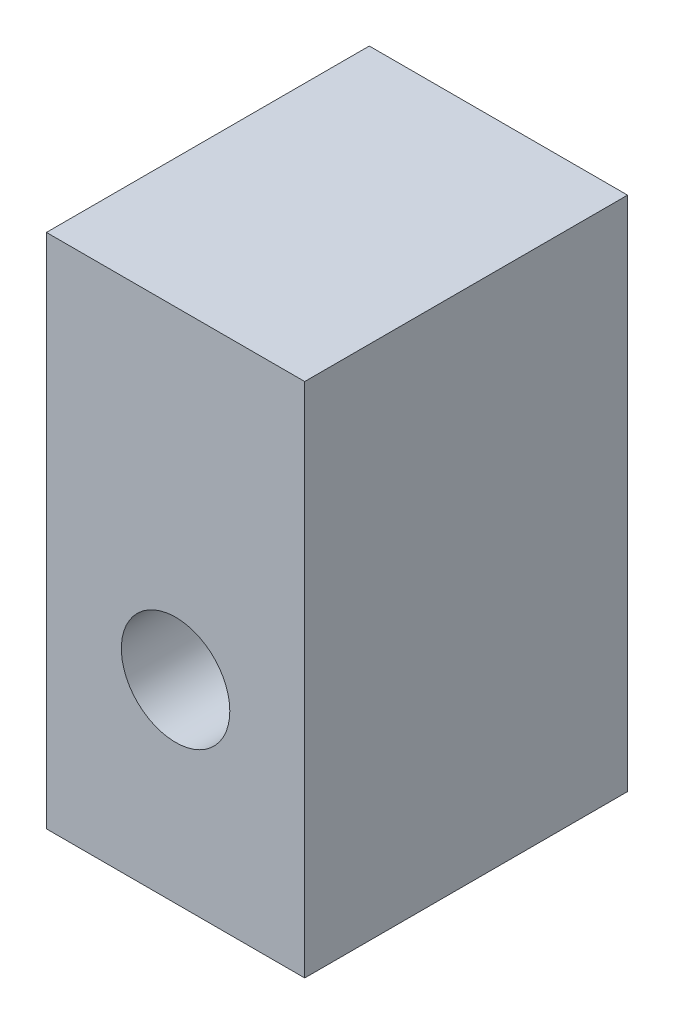
ISO-10303-21;
HEADER;
FILE_DESCRIPTION(('STEP AP214'),'2;1');
FILE_NAME('part.step','',(''),(''),'','','');
FILE_SCHEMA(('AUTOMOTIVE_DESIGN { 1 0 10303 214 1 1 1 1 }'));
ENDSEC;
DATA;
#1=APPLICATION_CONTEXT('core data for automotive mechanical design processes');
#2=APPLICATION_PROTOCOL_DEFINITION('international standard','automotive_design',2000,#1);
#3=PRODUCT_CONTEXT('',#1,'mechanical');
#4=PRODUCT('Part','Part','',(#3));
#5=PRODUCT_RELATED_PRODUCT_CATEGORY('part','',(#4));
#6=PRODUCT_DEFINITION_FORMATION('','',#4);
#7=PRODUCT_DEFINITION_CONTEXT('part definition',#1,'design');
#8=PRODUCT_DEFINITION('design','',#6,#7);
#9=PRODUCT_DEFINITION_SHAPE('','',#8);
#10=(LENGTH_UNIT() NAMED_UNIT(*) SI_UNIT(.MILLI.,.METRE.));
#11=(NAMED_UNIT(*) PLANE_ANGLE_UNIT() SI_UNIT($,.RADIAN.));
#12=(NAMED_UNIT(*) SI_UNIT($,.STERADIAN.) SOLID_ANGLE_UNIT());
#13=UNCERTAINTY_MEASURE_WITH_UNIT(LENGTH_MEASURE(1.E-05),#10,'distance_accuracy_value','');
#14=(GEOMETRIC_REPRESENTATION_CONTEXT(3) GLOBAL_UNCERTAINTY_ASSIGNED_CONTEXT((#13)) GLOBAL_UNIT_ASSIGNED_CONTEXT((#10,
#11,#12)) REPRESENTATION_CONTEXT('',''));
#15=CARTESIAN_POINT('',(0.,0.,0.));
#16=DIRECTION('',(0.,0.,1.));
#17=DIRECTION('',(1.,0.,0.));
#18=AXIS2_PLACEMENT_3D('',#15,#16,#17);
#19=CARTESIAN_POINT('',(25.4,101.6,31.75));
#20=DIRECTION('',(-1.,0.,0.));
#21=DIRECTION('',(0.,0.,1.));
#22=AXIS2_PLACEMENT_3D('',#19,#20,#21);
#23=PLANE('',#22);
#24=DIRECTION('',(0.,0.,-1.));
#25=VECTOR('',#24,1.);
#26=CARTESIAN_POINT('',(25.4,0.,31.75));
#27=LINE('',#26,#25);
#28=CARTESIAN_POINT('',(25.4,0.,31.75));
#29=VERTEX_POINT('',#28);
#30=CARTESIAN_POINT('',(25.4,0.,-31.75));
#31=VERTEX_POINT('',#30);
#32=EDGE_CURVE('E96',#29,#31,#27,.T.);
#33=ORIENTED_EDGE('',*,*,#32,.T.);
#34=DIRECTION('',(0.,-1.,0.));
#35=VECTOR('',#34,1.);
#36=CARTESIAN_POINT('',(25.4,101.6,-31.75));
#37=LINE('',#36,#35);
#38=CARTESIAN_POINT('',(25.4,101.6,-31.75));
#39=VERTEX_POINT('',#38);
#40=EDGE_CURVE('E11',#39,#31,#37,.T.);
#41=ORIENTED_EDGE('',*,*,#40,.F.);
#42=DIRECTION('',(0.,0.,-1.));
#43=VECTOR('',#42,1.);
#44=CARTESIAN_POINT('',(25.4,101.6,31.75));
#45=LINE('',#44,#43);
#46=CARTESIAN_POINT('',(25.4,101.6,31.75));
#47=VERTEX_POINT('',#46);
#48=EDGE_CURVE('E84',#47,#39,#45,.T.);
#49=ORIENTED_EDGE('',*,*,#48,.F.);
#50=DIRECTION('',(0.,-1.,0.));
#51=VECTOR('',#50,1.);
#52=CARTESIAN_POINT('',(25.4,101.6,31.75));
#53=LINE('',#52,#51);
#54=EDGE_CURVE('E92',#47,#29,#53,.T.);
#55=ORIENTED_EDGE('',*,*,#54,.T.);
#56=EDGE_LOOP('',(#33,#41,#49,#55));
#57=FACE_BOUND('',#56,.T.);
#58=ADVANCED_FACE('F33',(#57),#23,.F.);
#59=CARTESIAN_POINT('',(-25.4,101.6,-31.75));
#60=DIRECTION('',(0.,0.,1.));
#61=DIRECTION('',(1.,0.,0.));
#62=AXIS2_PLACEMENT_3D('',#59,#60,#61);
#63=PLANE('',#62);
#64=CARTESIAN_POINT('',(0.,38.1,-31.75));
#65=DIRECTION('',(0.,0.,1.));
#66=DIRECTION('',(1.,0.,0.));
#67=AXIS2_PLACEMENT_3D('',#64,#65,#66);
#68=CIRCLE('',#67,10.668);
#69=CARTESIAN_POINT('',(10.668,38.1,-31.75));
#70=VERTEX_POINT('',#69);
#71=EDGE_CURVE('E99',#70,#70,#68,.T.);
#72=ORIENTED_EDGE('',*,*,#71,.T.);
#73=EDGE_LOOP('',(#72));
#74=FACE_BOUND('',#73,.T.);
#75=DIRECTION('',(-1.,0.,0.));
#76=VECTOR('',#75,1.);
#77=CARTESIAN_POINT('',(-25.4,0.,-31.75));
#78=LINE('',#77,#76);
#79=CARTESIAN_POINT('',(-25.4,0.,-31.75));
#80=VERTEX_POINT('',#79);
#81=EDGE_CURVE('E88',#31,#80,#78,.T.);
#82=ORIENTED_EDGE('',*,*,#81,.T.);
#83=DIRECTION('',(0.,-1.,0.));
#84=VECTOR('',#83,1.);
#85=CARTESIAN_POINT('',(-25.4,101.6,-31.75));
#86=LINE('',#85,#84);
#87=CARTESIAN_POINT('',(-25.4,101.6,-31.75));
#88=VERTEX_POINT('',#87);
#89=EDGE_CURVE('E41',#88,#80,#86,.T.);
#90=ORIENTED_EDGE('',*,*,#89,.F.);
#91=DIRECTION('',(-1.,0.,0.));
#92=VECTOR('',#91,1.);
#93=CARTESIAN_POINT('',(-25.4,101.6,-31.75));
#94=LINE('',#93,#92);
#95=EDGE_CURVE('E79',#39,#88,#94,.T.);
#96=ORIENTED_EDGE('',*,*,#95,.F.);
#97=ORIENTED_EDGE('',*,*,#40,.T.);
#98=EDGE_LOOP('',(#82,#90,#96,#97));
#99=FACE_BOUND('',#98,.T.);
#100=ADVANCED_FACE('F87',(#74,#99),#63,.F.);
#101=CARTESIAN_POINT('',(-25.4,101.6,31.75));
#102=DIRECTION('',(1.,0.,0.));
#103=DIRECTION('',(0.,0.,-1.));
#104=AXIS2_PLACEMENT_3D('',#101,#102,#103);
#105=PLANE('',#104);
#106=DIRECTION('',(0.,0.,1.));
#107=VECTOR('',#106,1.);
#108=CARTESIAN_POINT('',(-25.4,0.,31.75));
#109=LINE('',#108,#107);
#110=CARTESIAN_POINT('',(-25.4,0.,31.75));
#111=VERTEX_POINT('',#110);
#112=EDGE_CURVE('E66',#80,#111,#109,.T.);
#113=ORIENTED_EDGE('',*,*,#112,.T.);
#114=DIRECTION('',(0.,-1.,0.));
#115=VECTOR('',#114,1.);
#116=CARTESIAN_POINT('',(-25.4,101.6,31.75));
#117=LINE('',#116,#115);
#118=CARTESIAN_POINT('',(-25.4,101.6,31.75));
#119=VERTEX_POINT('',#118);
#120=EDGE_CURVE('E89',#119,#111,#117,.T.);
#121=ORIENTED_EDGE('',*,*,#120,.F.);
#122=DIRECTION('',(0.,0.,1.));
#123=VECTOR('',#122,1.);
#124=CARTESIAN_POINT('',(-25.4,101.6,31.75));
#125=LINE('',#124,#123);
#126=EDGE_CURVE('E82',#88,#119,#125,.T.);
#127=ORIENTED_EDGE('',*,*,#126,.F.);
#128=ORIENTED_EDGE('',*,*,#89,.T.);
#129=EDGE_LOOP('',(#113,#121,#127,#128));
#130=FACE_BOUND('',#129,.T.);
#131=ADVANCED_FACE('F90',(#130),#105,.F.);
#132=CARTESIAN_POINT('',(-25.4,101.6,31.75));
#133=DIRECTION('',(0.,0.,-1.));
#134=DIRECTION('',(-1.,0.,0.));
#135=AXIS2_PLACEMENT_3D('',#132,#133,#134);
#136=PLANE('',#135);
#137=CARTESIAN_POINT('',(0.,38.1,31.75));
#138=DIRECTION('',(0.,0.,1.));
#139=DIRECTION('',(1.,0.,0.));
#140=AXIS2_PLACEMENT_3D('',#137,#138,#139);
#141=CIRCLE('',#140,10.668);
#142=CARTESIAN_POINT('',(10.668,38.1,31.75));
#143=VERTEX_POINT('',#142);
#144=EDGE_CURVE('E112',#143,#143,#141,.T.);
#145=ORIENTED_EDGE('',*,*,#144,.F.);
#146=EDGE_LOOP('',(#145));
#147=FACE_BOUND('',#146,.T.);
#148=DIRECTION('',(1.,0.,0.));
#149=VECTOR('',#148,1.);
#150=CARTESIAN_POINT('',(-25.4,0.,31.75));
#151=LINE('',#150,#149);
#152=EDGE_CURVE('E72',#111,#29,#151,.T.);
#153=ORIENTED_EDGE('',*,*,#152,.T.);
#154=ORIENTED_EDGE('',*,*,#54,.F.);
#155=DIRECTION('',(1.,0.,0.));
#156=VECTOR('',#155,1.);
#157=CARTESIAN_POINT('',(-25.4,101.6,31.75));
#158=LINE('',#157,#156);
#159=EDGE_CURVE('E49',#119,#47,#158,.T.);
#160=ORIENTED_EDGE('',*,*,#159,.F.);
#161=ORIENTED_EDGE('',*,*,#120,.T.);
#162=EDGE_LOOP('',(#153,#154,#160,#161));
#163=FACE_BOUND('',#162,.T.);
#164=ADVANCED_FACE('F104',(#147,#163),#136,.F.);
#165=CARTESIAN_POINT('',(0.,101.6,0.));
#166=DIRECTION('',(0.,-1.,0.));
#167=DIRECTION('',(0.,0.,-1.));
#168=AXIS2_PLACEMENT_3D('',#165,#166,#167);
#169=PLANE('',#168);
#170=ORIENTED_EDGE('',*,*,#48,.T.);
#171=ORIENTED_EDGE('',*,*,#95,.T.);
#172=ORIENTED_EDGE('',*,*,#126,.T.);
#173=ORIENTED_EDGE('',*,*,#159,.T.);
#174=EDGE_LOOP('',(#170,#171,#172,#173));
#175=FACE_BOUND('',#174,.T.);
#176=ADVANCED_FACE('F80',(#175),#169,.F.);
#177=CARTESIAN_POINT('',(0.,0.,0.));
#178=DIRECTION('',(0.,-1.,0.));
#179=DIRECTION('',(0.,0.,-1.));
#180=AXIS2_PLACEMENT_3D('',#177,#178,#179);
#181=PLANE('',#180);
#182=ORIENTED_EDGE('',*,*,#32,.F.);
#183=ORIENTED_EDGE('',*,*,#152,.F.);
#184=ORIENTED_EDGE('',*,*,#112,.F.);
#185=ORIENTED_EDGE('',*,*,#81,.F.);
#186=EDGE_LOOP('',(#182,#183,#184,#185));
#187=FACE_BOUND('',#186,.T.);
#188=ADVANCED_FACE('F107',(#187),#181,.T.);
#189=CARTESIAN_POINT('',(0.,38.1,-31.75));
#190=DIRECTION('',(0.,0.,1.));
#191=DIRECTION('',(1.,0.,0.));
#192=AXIS2_PLACEMENT_3D('',#189,#190,#191);
#193=CYLINDRICAL_SURFACE('',#192,10.668);
#194=ORIENTED_EDGE('',*,*,#71,.F.);
#195=EDGE_LOOP('',(#194));
#196=FACE_BOUND('',#195,.T.);
#197=ORIENTED_EDGE('',*,*,#144,.T.);
#198=EDGE_LOOP('',(#197));
#199=FACE_BOUND('',#198,.T.);
#200=ADVANCED_FACE('F116',(#196,#199),#193,.F.);
#201=CLOSED_SHELL('',(#58,#100,#131,#164,#176,#188,#200));
#202=MANIFOLD_SOLID_BREP('B2',#201);
#203=ADVANCED_BREP_SHAPE_REPRESENTATION('',(#18,#202),#14);
#204=SHAPE_DEFINITION_REPRESENTATION(#9,#203);
ENDSEC;
END-ISO-10303-21;
